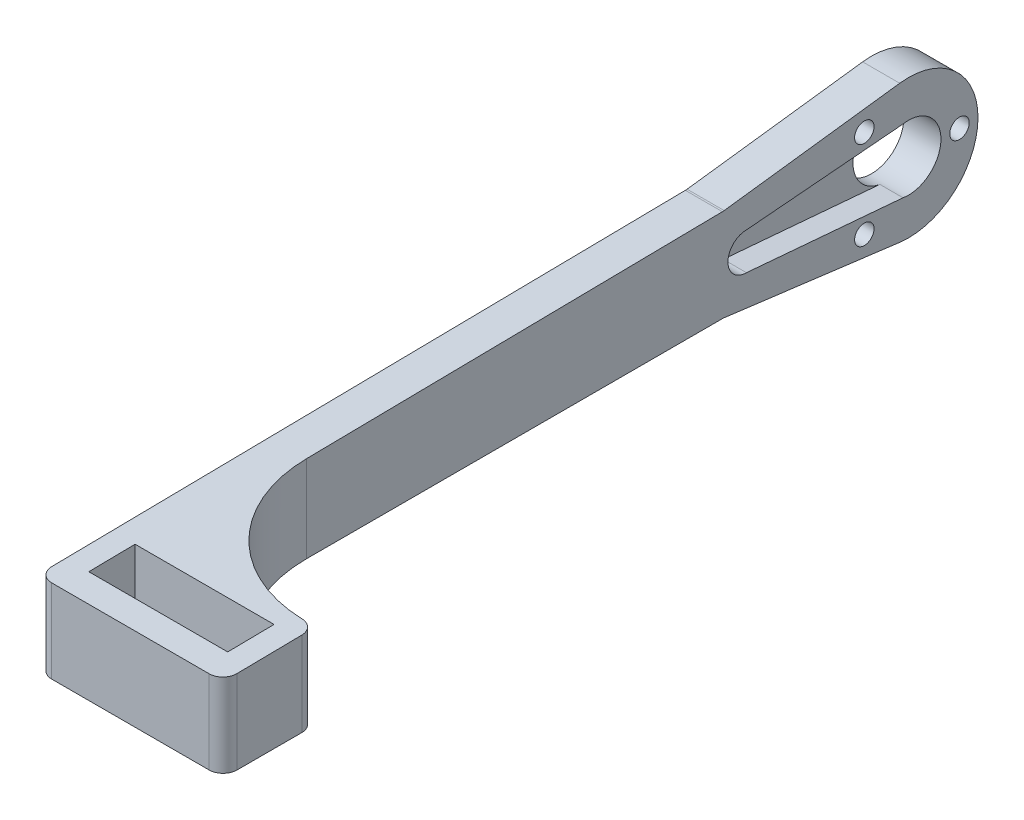
ISO-10303-21;
HEADER;
FILE_DESCRIPTION(('STEP AP214'),'2;1');
FILE_NAME('part.step','',(''),(''),'','','');
FILE_SCHEMA(('AUTOMOTIVE_DESIGN { 1 0 10303 214 1 1 1 1 }'));
ENDSEC;
DATA;
#1=APPLICATION_CONTEXT('core data for automotive mechanical design processes');
#2=APPLICATION_PROTOCOL_DEFINITION('international standard','automotive_design',2000,#1);
#3=PRODUCT_CONTEXT('',#1,'mechanical');
#4=PRODUCT('Part','Part','',(#3));
#5=PRODUCT_RELATED_PRODUCT_CATEGORY('part','',(#4));
#6=PRODUCT_DEFINITION_FORMATION('','',#4);
#7=PRODUCT_DEFINITION_CONTEXT('part definition',#1,'design');
#8=PRODUCT_DEFINITION('design','',#6,#7);
#9=PRODUCT_DEFINITION_SHAPE('','',#8);
#10=(LENGTH_UNIT() NAMED_UNIT(*) SI_UNIT(.MILLI.,.METRE.));
#11=(NAMED_UNIT(*) PLANE_ANGLE_UNIT() SI_UNIT($,.RADIAN.));
#12=(NAMED_UNIT(*) SI_UNIT($,.STERADIAN.) SOLID_ANGLE_UNIT());
#13=UNCERTAINTY_MEASURE_WITH_UNIT(LENGTH_MEASURE(1.E-05),#10,'distance_accuracy_value','');
#14=(GEOMETRIC_REPRESENTATION_CONTEXT(3) GLOBAL_UNCERTAINTY_ASSIGNED_CONTEXT((#13)) GLOBAL_UNIT_ASSIGNED_CONTEXT((#10,
#11,#12)) REPRESENTATION_CONTEXT('',''));
#15=CARTESIAN_POINT('',(0.,0.,0.));
#16=DIRECTION('',(0.,0.,1.));
#17=DIRECTION('',(1.,0.,0.));
#18=AXIS2_PLACEMENT_3D('',#15,#16,#17);
#19=CARTESIAN_POINT('',(4.,0.,0.));
#20=DIRECTION('',(1.,0.,0.));
#21=DIRECTION('',(0.,0.,-1.));
#22=AXIS2_PLACEMENT_3D('',#19,#20,#21);
#23=PLANE('',#22);
#24=DIRECTION('',(0.,0.0143037991941371,-0.999897695431195));
#25=VECTOR('',#24,1.);
#26=CARTESIAN_POINT('',(4.,4.57127503931959,0.0653932902559612));
#27=LINE('',#26,#25);
#28=CARTESIAN_POINT('',(4.,4.35752316910403,15.0075774975294));
#29=VERTEX_POINT('',#28);
#30=CARTESIAN_POINT('',(4.,5.,-29.9043437243606));
#31=VERTEX_POINT('',#30);
#32=EDGE_CURVE('E263',#29,#31,#27,.T.);
#33=ORIENTED_EDGE('',*,*,#32,.F.);
#34=DIRECTION('',(0.,-1.,0.));
#35=VECTOR('',#34,1.);
#36=CARTESIAN_POINT('',(4.,-5.,15.0075774975294));
#37=LINE('',#36,#35);
#38=CARTESIAN_POINT('',(4.,-5.,15.0075774975294));
#39=VERTEX_POINT('',#38);
#40=EDGE_CURVE('E296',#29,#39,#37,.T.);
#41=ORIENTED_EDGE('',*,*,#40,.T.);
#42=DIRECTION('',(0.,0.,-1.));
#43=VECTOR('',#42,1.);
#44=CARTESIAN_POINT('',(4.,-5.,0.));
#45=LINE('',#44,#43);
#46=CARTESIAN_POINT('',(4.,-5.,-29.9043437243606));
#47=VERTEX_POINT('',#46);
#48=EDGE_CURVE('E310',#39,#47,#45,.T.);
#49=ORIENTED_EDGE('',*,*,#48,.T.);
#50=CARTESIAN_POINT('',(4.,-6.5,-29.9043437243606));
#51=DIRECTION('',(1.,0.,0.));
#52=DIRECTION('',(0.,0.,-1.));
#53=AXIS2_PLACEMENT_3D('',#50,#51,#52);
#54=CIRCLE('',#53,1.5);
#55=CARTESIAN_POINT('',(4.,-5.01215075037613,-30.0948814119546));
#56=VERTEX_POINT('',#55);
#57=EDGE_CURVE('E294',#47,#56,#54,.F.);
#58=ORIENTED_EDGE('',*,*,#57,.T.);
#59=DIRECTION('',(0.,-0.127025125062688,-0.991899499749248));
#60=VECTOR('',#59,1.);
#61=CARTESIAN_POINT('',(4.,-1.13943834785606,0.145919318110584));
#62=LINE('',#61,#60);
#63=CARTESIAN_POINT('',(4.,-7.43924624811936,-49.0473115620298));
#64=VERTEX_POINT('',#63);
#65=EDGE_CURVE('E430',#56,#64,#62,.T.);
#66=ORIENTED_EDGE('',*,*,#65,.T.);
#67=CARTESIAN_POINT('',(4.,0.,-50.));
#68=DIRECTION('',(1.,0.,0.));
#69=DIRECTION('',(0.,0.,-1.));
#70=AXIS2_PLACEMENT_3D('',#67,#68,#69);
#71=CIRCLE('',#70,7.5);
#72=CARTESIAN_POINT('',(4.,7.43924624811936,-49.0473115620298));
#73=VERTEX_POINT('',#72);
#74=EDGE_CURVE('E423',#73,#64,#71,.F.);
#75=ORIENTED_EDGE('',*,*,#74,.F.);
#76=DIRECTION('',(0.,0.127025125062688,-0.991899499749248));
#77=VECTOR('',#76,1.);
#78=CARTESIAN_POINT('',(4.,1.13943834785606,0.145919318110584));
#79=LINE('',#78,#77);
#80=CARTESIAN_POINT('',(4.,5.01215075037613,-30.0948814119546));
#81=VERTEX_POINT('',#80);
#82=EDGE_CURVE('E426',#81,#73,#79,.T.);
#83=ORIENTED_EDGE('',*,*,#82,.F.);
#84=CARTESIAN_POINT('',(4.,6.5,-29.9043437243606));
#85=DIRECTION('',(1.,0.,0.));
#86=DIRECTION('',(0.,0.,-1.));
#87=AXIS2_PLACEMENT_3D('',#84,#85,#86);
#88=CIRCLE('',#87,1.5);
#89=EDGE_CURVE('E284',#81,#31,#88,.F.);
#90=ORIENTED_EDGE('',*,*,#89,.T.);
#91=EDGE_LOOP('',(#33,#41,#49,#58,#66,#75,#83,#90));
#92=FACE_BOUND('',#91,.T.);
#93=CARTESIAN_POINT('',(4.,-4.77297077300917,-45.2270292269908));
#94=DIRECTION('',(-1.,0.,0.));
#95=DIRECTION('',(0.,0.,1.));
#96=AXIS2_PLACEMENT_3D('',#93,#94,#95);
#97=CIRCLE('',#96,1.05);
#98=CARTESIAN_POINT('',(4.,-4.77297077300917,-44.1770292269908));
#99=VERTEX_POINT('',#98);
#100=EDGE_CURVE('E384',#99,#99,#97,.T.);
#101=ORIENTED_EDGE('',*,*,#100,.T.);
#102=EDGE_LOOP('',(#101));
#103=FACE_BOUND('',#102,.T.);
#104=CARTESIAN_POINT('',(4.,0.,-32.5));
#105=DIRECTION('',(1.,0.,0.));
#106=DIRECTION('',(0.,0.,-1.));
#107=AXIS2_PLACEMENT_3D('',#104,#105,#106);
#108=CIRCLE('',#107,2.);
#109=CARTESIAN_POINT('',(4.,-2.,-32.5));
#110=VERTEX_POINT('',#109);
#111=CARTESIAN_POINT('',(4.,2.,-32.5));
#112=VERTEX_POINT('',#111);
#113=EDGE_CURVE('E374',#110,#112,#108,.F.);
#114=ORIENTED_EDGE('',*,*,#113,.T.);
#115=DIRECTION('',(0.,0.0854011413464358,-0.996346649041751));
#116=VECTOR('',#115,1.);
#117=CARTESIAN_POINT('',(4.,-0.779983792544568,-0.0668557536466772));
#118=LINE('',#117,#116);
#119=CARTESIAN_POINT('',(4.,3.44894651539708,-49.404376012966));
#120=VERTEX_POINT('',#119);
#121=EDGE_CURVE('E393',#112,#120,#118,.T.);
#122=ORIENTED_EDGE('',*,*,#121,.T.);
#123=CARTESIAN_POINT('',(4.,0.,-50.));
#124=DIRECTION('',(1.,0.,0.));
#125=DIRECTION('',(0.,0.,-1.));
#126=AXIS2_PLACEMENT_3D('',#123,#124,#125);
#127=CIRCLE('',#126,3.5);
#128=CARTESIAN_POINT('',(4.,-3.44894651539708,-49.404376012966));
#129=VERTEX_POINT('',#128);
#130=EDGE_CURVE('E410',#129,#120,#127,.T.);
#131=ORIENTED_EDGE('',*,*,#130,.F.);
#132=DIRECTION('',(0.,-0.0854011413464358,-0.996346649041751));
#133=VECTOR('',#132,1.);
#134=CARTESIAN_POINT('',(4.,0.779983792544568,-0.0668557536466772));
#135=LINE('',#134,#133);
#136=EDGE_CURVE('E403',#110,#129,#135,.T.);
#137=ORIENTED_EDGE('',*,*,#136,.F.);
#138=EDGE_LOOP('',(#114,#122,#131,#137));
#139=FACE_BOUND('',#138,.T.);
#140=CARTESIAN_POINT('',(4.,4.77297077300917,-45.2270292269908));
#141=DIRECTION('',(1.,0.,0.));
#142=DIRECTION('',(0.,0.,-1.));
#143=AXIS2_PLACEMENT_3D('',#140,#141,#142);
#144=CIRCLE('',#143,1.05);
#145=CARTESIAN_POINT('',(4.,4.77297077300917,-46.2770292269908));
#146=VERTEX_POINT('',#145);
#147=EDGE_CURVE('E378',#146,#146,#144,.T.);
#148=ORIENTED_EDGE('',*,*,#147,.F.);
#149=EDGE_LOOP('',(#148));
#150=FACE_BOUND('',#149,.T.);
#151=CARTESIAN_POINT('',(4.,0.,-55.5));
#152=DIRECTION('',(1.,0.,0.));
#153=DIRECTION('',(0.,0.,-1.));
#154=AXIS2_PLACEMENT_3D('',#151,#152,#153);
#155=CIRCLE('',#154,1.05);
#156=CARTESIAN_POINT('',(4.,0.,-56.55));
#157=VERTEX_POINT('',#156);
#158=EDGE_CURVE('E375',#157,#157,#155,.T.);
#159=ORIENTED_EDGE('',*,*,#158,.F.);
#160=EDGE_LOOP('',(#159));
#161=FACE_BOUND('',#160,.T.);
#162=ADVANCED_FACE('F117',(#92,#103,#139,#150,#161),#23,.T.);
#163=CARTESIAN_POINT('',(0.,0.,0.));
#164=DIRECTION('',(1.,0.,0.));
#165=DIRECTION('',(0.,0.,-1.));
#166=AXIS2_PLACEMENT_3D('',#163,#164,#165);
#167=PLANE('',#166);
#168=CARTESIAN_POINT('',(0.,4.77297077300917,-45.2270292269908));
#169=DIRECTION('',(1.,0.,0.));
#170=DIRECTION('',(0.,0.,-1.));
#171=AXIS2_PLACEMENT_3D('',#168,#169,#170);
#172=CIRCLE('',#171,1.05);
#173=CARTESIAN_POINT('',(0.,4.77297077300917,-46.2770292269908));
#174=VERTEX_POINT('',#173);
#175=EDGE_CURVE('E381',#174,#174,#172,.T.);
#176=ORIENTED_EDGE('',*,*,#175,.T.);
#177=EDGE_LOOP('',(#176));
#178=FACE_BOUND('',#177,.T.);
#179=CARTESIAN_POINT('',(0.,-4.77297077300917,-45.2270292269908));
#180=DIRECTION('',(-1.,0.,0.));
#181=DIRECTION('',(0.,0.,1.));
#182=AXIS2_PLACEMENT_3D('',#179,#180,#181);
#183=CIRCLE('',#182,1.05);
#184=CARTESIAN_POINT('',(0.,-4.77297077300917,-44.1770292269908));
#185=VERTEX_POINT('',#184);
#186=EDGE_CURVE('E370',#185,#185,#183,.T.);
#187=ORIENTED_EDGE('',*,*,#186,.F.);
#188=EDGE_LOOP('',(#187));
#189=FACE_BOUND('',#188,.T.);
#190=CARTESIAN_POINT('',(0.,0.,-50.));
#191=DIRECTION('',(1.,0.,0.));
#192=DIRECTION('',(0.,0.,-1.));
#193=AXIS2_PLACEMENT_3D('',#190,#191,#192);
#194=CIRCLE('',#193,3.5);
#195=CARTESIAN_POINT('',(0.,0.,-53.5));
#196=VERTEX_POINT('',#195);
#197=EDGE_CURVE('E419',#196,#196,#194,.T.);
#198=ORIENTED_EDGE('',*,*,#197,.T.);
#199=EDGE_LOOP('',(#198));
#200=FACE_BOUND('',#199,.T.);
#201=DIRECTION('',(0.,-1.,0.));
#202=VECTOR('',#201,1.);
#203=CARTESIAN_POINT('',(0.,5.,38.5));
#204=LINE('',#203,#202);
#205=CARTESIAN_POINT('',(0.,-5.,38.5));
#206=VERTEX_POINT('',#205);
#207=CARTESIAN_POINT('',(0.,4.0214578940318,38.5));
#208=VERTEX_POINT('',#207);
#209=EDGE_CURVE('E269',#206,#208,#204,.F.);
#210=ORIENTED_EDGE('',*,*,#209,.T.);
#211=DIRECTION('',(0.,0.0143037991941371,-0.999897695431195));
#212=VECTOR('',#211,1.);
#213=CARTESIAN_POINT('',(0.,4.57127503931959,0.0653932902559612));
#214=LINE('',#213,#212);
#215=CARTESIAN_POINT('',(0.,5.,-29.9043437243606));
#216=VERTEX_POINT('',#215);
#217=EDGE_CURVE('E260',#208,#216,#214,.T.);
#218=ORIENTED_EDGE('',*,*,#217,.T.);
#219=CARTESIAN_POINT('',(0.,6.5,-29.9043437243606));
#220=DIRECTION('',(1.,0.,0.));
#221=DIRECTION('',(0.,0.,-1.));
#222=AXIS2_PLACEMENT_3D('',#219,#220,#221);
#223=CIRCLE('',#222,1.5);
#224=CARTESIAN_POINT('',(0.,5.01215075037613,-30.0948814119546));
#225=VERTEX_POINT('',#224);
#226=EDGE_CURVE('E275',#216,#225,#223,.T.);
#227=ORIENTED_EDGE('',*,*,#226,.T.);
#228=DIRECTION('',(0.,0.127025125062688,-0.991899499749248));
#229=VECTOR('',#228,1.);
#230=CARTESIAN_POINT('',(0.,1.13943834785606,0.145919318110584));
#231=LINE('',#230,#229);
#232=CARTESIAN_POINT('',(0.,7.43924624811936,-49.0473115620298));
#233=VERTEX_POINT('',#232);
#234=EDGE_CURVE('E435',#225,#233,#231,.T.);
#235=ORIENTED_EDGE('',*,*,#234,.T.);
#236=CARTESIAN_POINT('',(0.,0.,-50.));
#237=DIRECTION('',(1.,0.,0.));
#238=DIRECTION('',(0.,0.,-1.));
#239=AXIS2_PLACEMENT_3D('',#236,#237,#238);
#240=CIRCLE('',#239,7.5);
#241=CARTESIAN_POINT('',(0.,-7.43924624811936,-49.0473115620298));
#242=VERTEX_POINT('',#241);
#243=EDGE_CURVE('E422',#233,#242,#240,.F.);
#244=ORIENTED_EDGE('',*,*,#243,.T.);
#245=DIRECTION('',(0.,-0.127025125062688,-0.991899499749248));
#246=VECTOR('',#245,1.);
#247=CARTESIAN_POINT('',(0.,-1.13943834785606,0.145919318110584));
#248=LINE('',#247,#246);
#249=CARTESIAN_POINT('',(0.,-5.01215075037613,-30.0948814119546));
#250=VERTEX_POINT('',#249);
#251=EDGE_CURVE('E427',#250,#242,#248,.T.);
#252=ORIENTED_EDGE('',*,*,#251,.F.);
#253=CARTESIAN_POINT('',(0.,-6.5,-29.9043437243606));
#254=DIRECTION('',(1.,0.,0.));
#255=DIRECTION('',(0.,0.,-1.));
#256=AXIS2_PLACEMENT_3D('',#253,#254,#255);
#257=CIRCLE('',#256,1.5);
#258=CARTESIAN_POINT('',(0.,-5.,-29.9043437243606));
#259=VERTEX_POINT('',#258);
#260=EDGE_CURVE('E287',#250,#259,#257,.T.);
#261=ORIENTED_EDGE('',*,*,#260,.T.);
#262=DIRECTION('',(0.,0.,-1.));
#263=VECTOR('',#262,1.);
#264=CARTESIAN_POINT('',(0.,-5.,0.));
#265=LINE('',#264,#263);
#266=EDGE_CURVE('E437',#206,#259,#265,.T.);
#267=ORIENTED_EDGE('',*,*,#266,.F.);
#268=EDGE_LOOP('',(#210,#218,#227,#235,#244,#252,#261,#267));
#269=FACE_BOUND('',#268,.T.);
#270=CARTESIAN_POINT('',(0.,0.,-55.5));
#271=DIRECTION('',(1.,0.,0.));
#272=DIRECTION('',(0.,0.,-1.));
#273=AXIS2_PLACEMENT_3D('',#270,#271,#272);
#274=CIRCLE('',#273,1.05);
#275=CARTESIAN_POINT('',(0.,0.,-56.55));
#276=VERTEX_POINT('',#275);
#277=EDGE_CURVE('E371',#276,#276,#274,.T.);
#278=ORIENTED_EDGE('',*,*,#277,.T.);
#279=EDGE_LOOP('',(#278));
#280=FACE_BOUND('',#279,.T.);
#281=ADVANCED_FACE('F273',(#178,#189,#200,#269,#280),#167,.F.);
#282=CARTESIAN_POINT('',(-6.,0.,-50.));
#283=DIRECTION('',(1.,0.,0.));
#284=DIRECTION('',(0.,0.,-1.));
#285=AXIS2_PLACEMENT_3D('',#282,#283,#284);
#286=CYLINDRICAL_SURFACE('',#285,3.5);
#287=ORIENTED_EDGE('',*,*,#197,.F.);
#288=EDGE_LOOP('',(#287));
#289=FACE_BOUND('',#288,.T.);
#290=DIRECTION('',(1.,0.,0.));
#291=VECTOR('',#290,1.);
#292=CARTESIAN_POINT('',(1.5,3.44894651539708,-49.404376012966));
#293=LINE('',#292,#291);
#294=CARTESIAN_POINT('',(1.5,3.44894651539708,-49.404376012966));
#295=VERTEX_POINT('',#294);
#296=EDGE_CURVE('E411',#295,#120,#293,.T.);
#297=ORIENTED_EDGE('',*,*,#296,.F.);
#298=CARTESIAN_POINT('',(1.5,0.,-50.));
#299=DIRECTION('',(1.,0.,0.));
#300=DIRECTION('',(0.,0.,-1.));
#301=AXIS2_PLACEMENT_3D('',#298,#299,#300);
#302=CIRCLE('',#301,3.5);
#303=CARTESIAN_POINT('',(1.5,-3.44894651539708,-49.404376012966));
#304=VERTEX_POINT('',#303);
#305=EDGE_CURVE('E395',#304,#295,#302,.F.);
#306=ORIENTED_EDGE('',*,*,#305,.F.);
#307=DIRECTION('',(1.,0.,0.));
#308=VECTOR('',#307,1.);
#309=CARTESIAN_POINT('',(1.5,-3.44894651539708,-49.404376012966));
#310=LINE('',#309,#308);
#311=EDGE_CURVE('E413',#304,#129,#310,.T.);
#312=ORIENTED_EDGE('',*,*,#311,.T.);
#313=ORIENTED_EDGE('',*,*,#130,.T.);
#314=EDGE_LOOP('',(#297,#306,#312,#313));
#315=FACE_BOUND('',#314,.T.);
#316=ADVANCED_FACE('F509',(#289,#315),#286,.F.);
#317=CARTESIAN_POINT('',(4.,1.13943834785606,0.145919318110584));
#318=DIRECTION('',(0.,0.991899499749248,0.127025125062688));
#319=DIRECTION('',(0.,-0.127025125062688,0.991899499749248));
#320=AXIS2_PLACEMENT_3D('',#317,#318,#319);
#321=PLANE('',#320);
#322=ORIENTED_EDGE('',*,*,#234,.F.);
#323=DIRECTION('',(-1.,0.,0.));
#324=VECTOR('',#323,1.);
#325=CARTESIAN_POINT('',(4.,5.01215075037613,-30.0948814119546));
#326=LINE('',#325,#324);
#327=EDGE_CURVE('E283',#225,#81,#326,.F.);
#328=ORIENTED_EDGE('',*,*,#327,.T.);
#329=ORIENTED_EDGE('',*,*,#82,.T.);
#330=DIRECTION('',(-1.,0.,0.));
#331=VECTOR('',#330,1.);
#332=CARTESIAN_POINT('',(4.,7.43924624811936,-49.0473115620298));
#333=LINE('',#332,#331);
#334=EDGE_CURVE('E443',#73,#233,#333,.T.);
#335=ORIENTED_EDGE('',*,*,#334,.T.);
#336=EDGE_LOOP('',(#322,#328,#329,#335));
#337=FACE_BOUND('',#336,.T.);
#338=ADVANCED_FACE('F458',(#337),#321,.T.);
#339=CARTESIAN_POINT('',(4.,0.,-50.));
#340=DIRECTION('',(-1.,0.,0.));
#341=DIRECTION('',(0.,0.,1.));
#342=AXIS2_PLACEMENT_3D('',#339,#340,#341);
#343=CYLINDRICAL_SURFACE('',#342,7.5);
#344=ORIENTED_EDGE('',*,*,#243,.F.);
#345=ORIENTED_EDGE('',*,*,#334,.F.);
#346=ORIENTED_EDGE('',*,*,#74,.T.);
#347=DIRECTION('',(-1.,0.,0.));
#348=VECTOR('',#347,1.);
#349=CARTESIAN_POINT('',(4.,-7.43924624811936,-49.0473115620298));
#350=LINE('',#349,#348);
#351=EDGE_CURVE('E432',#64,#242,#350,.T.);
#352=ORIENTED_EDGE('',*,*,#351,.T.);
#353=EDGE_LOOP('',(#344,#345,#346,#352));
#354=FACE_BOUND('',#353,.T.);
#355=ADVANCED_FACE('F465',(#354),#343,.T.);
#356=CARTESIAN_POINT('',(4.,-1.13943834785606,0.145919318110584));
#357=DIRECTION('',(0.,0.991899499749248,-0.127025125062688));
#358=DIRECTION('',(0.,0.127025125062688,0.991899499749248));
#359=AXIS2_PLACEMENT_3D('',#356,#357,#358);
#360=PLANE('',#359);
#361=ORIENTED_EDGE('',*,*,#65,.F.);
#362=DIRECTION('',(-1.,0.,0.));
#363=VECTOR('',#362,1.);
#364=CARTESIAN_POINT('',(0.,-5.01215075037613,-30.0948814119546));
#365=LINE('',#364,#363);
#366=EDGE_CURVE('E285',#56,#250,#365,.T.);
#367=ORIENTED_EDGE('',*,*,#366,.T.);
#368=ORIENTED_EDGE('',*,*,#251,.T.);
#369=ORIENTED_EDGE('',*,*,#351,.F.);
#370=EDGE_LOOP('',(#361,#367,#368,#369));
#371=FACE_BOUND('',#370,.T.);
#372=ADVANCED_FACE('F468',(#371),#360,.F.);
#373=CARTESIAN_POINT('',(4.,-5.,0.));
#374=DIRECTION('',(0.,1.,0.));
#375=DIRECTION('',(0.,0.,1.));
#376=AXIS2_PLACEMENT_3D('',#373,#374,#375);
#377=PLANE('',#376);
#378=DIRECTION('',(0.,0.,-1.));
#379=VECTOR('',#378,1.);
#380=CARTESIAN_POINT('',(17.5,-5.,37.));
#381=LINE('',#380,#379);
#382=CARTESIAN_POINT('',(17.5,-5.,37.));
#383=VERTEX_POINT('',#382);
#384=CARTESIAN_POINT('',(17.5,-5.,32.));
#385=VERTEX_POINT('',#384);
#386=EDGE_CURVE('E351',#383,#385,#381,.T.);
#387=ORIENTED_EDGE('',*,*,#386,.T.);
#388=DIRECTION('',(-1.,0.,0.));
#389=VECTOR('',#388,1.);
#390=CARTESIAN_POINT('',(17.5,-5.,32.));
#391=LINE('',#390,#389);
#392=CARTESIAN_POINT('',(2.5,-5.,32.));
#393=VERTEX_POINT('',#392);
#394=EDGE_CURVE('E343',#385,#393,#391,.T.);
#395=ORIENTED_EDGE('',*,*,#394,.T.);
#396=DIRECTION('',(0.,0.,-1.));
#397=VECTOR('',#396,1.);
#398=CARTESIAN_POINT('',(2.5,-5.,37.));
#399=LINE('',#398,#397);
#400=CARTESIAN_POINT('',(2.5,-5.,37.));
#401=VERTEX_POINT('',#400);
#402=EDGE_CURVE('E346',#401,#393,#399,.T.);
#403=ORIENTED_EDGE('',*,*,#402,.F.);
#404=DIRECTION('',(-1.,0.,0.));
#405=VECTOR('',#404,1.);
#406=CARTESIAN_POINT('',(17.5,-5.,37.));
#407=LINE('',#406,#405);
#408=EDGE_CURVE('E348',#383,#401,#407,.T.);
#409=ORIENTED_EDGE('',*,*,#408,.F.);
#410=EDGE_LOOP('',(#387,#395,#403,#409));
#411=FACE_BOUND('',#410,.T.);
#412=DIRECTION('',(-1.,0.,0.));
#413=VECTOR('',#412,1.);
#414=CARTESIAN_POINT('',(0.,-5.,40.));
#415=LINE('',#414,#413);
#416=CARTESIAN_POINT('',(18.5,-5.,40.));
#417=VERTEX_POINT('',#416);
#418=CARTESIAN_POINT('',(1.5,-5.,40.));
#419=VERTEX_POINT('',#418);
#420=EDGE_CURVE('E358',#417,#419,#415,.T.);
#421=ORIENTED_EDGE('',*,*,#420,.T.);
#422=CARTESIAN_POINT('',(1.5,-5.,38.5));
#423=DIRECTION('',(0.,1.,0.));
#424=DIRECTION('',(0.,0.,1.));
#425=AXIS2_PLACEMENT_3D('',#422,#423,#424);
#426=CIRCLE('',#425,1.5);
#427=EDGE_CURVE('E319',#419,#206,#426,.F.);
#428=ORIENTED_EDGE('',*,*,#427,.T.);
#429=ORIENTED_EDGE('',*,*,#266,.T.);
#430=DIRECTION('',(-1.,0.,0.));
#431=VECTOR('',#430,1.);
#432=CARTESIAN_POINT('',(4.,-5.,-29.9043437243606));
#433=LINE('',#432,#431);
#434=EDGE_CURVE('E451',#259,#47,#433,.F.);
#435=ORIENTED_EDGE('',*,*,#434,.T.);
#436=ORIENTED_EDGE('',*,*,#48,.F.);
#437=CARTESIAN_POINT('',(19.,-5.,15.0075774975294));
#438=DIRECTION('',(0.,1.,0.));
#439=DIRECTION('',(0.,0.,1.));
#440=AXIS2_PLACEMENT_3D('',#437,#438,#439);
#441=CIRCLE('',#440,15.);
#442=CARTESIAN_POINT('',(18.5454545454545,-5.,30.0006888634118));
#443=VERTEX_POINT('',#442);
#444=EDGE_CURVE('E125',#39,#443,#441,.T.);
#445=ORIENTED_EDGE('',*,*,#444,.T.);
#446=CARTESIAN_POINT('',(18.5,-5.,31.5));
#447=DIRECTION('',(0.,1.,0.));
#448=DIRECTION('',(0.,0.,1.));
#449=AXIS2_PLACEMENT_3D('',#446,#447,#448);
#450=CIRCLE('',#449,1.5);
#451=CARTESIAN_POINT('',(20.,-5.,31.5));
#452=VERTEX_POINT('',#451);
#453=EDGE_CURVE('E307',#443,#452,#450,.F.);
#454=ORIENTED_EDGE('',*,*,#453,.T.);
#455=DIRECTION('',(0.,0.,-1.));
#456=VECTOR('',#455,1.);
#457=CARTESIAN_POINT('',(20.,-5.,40.));
#458=LINE('',#457,#456);
#459=CARTESIAN_POINT('',(20.,-5.,38.5));
#460=VERTEX_POINT('',#459);
#461=EDGE_CURVE('E368',#460,#452,#458,.T.);
#462=ORIENTED_EDGE('',*,*,#461,.F.);
#463=CARTESIAN_POINT('',(18.5,-5.,38.5));
#464=DIRECTION('',(0.,1.,0.));
#465=DIRECTION('',(0.,0.,1.));
#466=AXIS2_PLACEMENT_3D('',#463,#464,#465);
#467=CIRCLE('',#466,1.5);
#468=EDGE_CURVE('E320',#460,#417,#467,.F.);
#469=ORIENTED_EDGE('',*,*,#468,.T.);
#470=EDGE_LOOP('',(#421,#428,#429,#435,#436,#445,#454,#462,#469));
#471=FACE_BOUND('',#470,.T.);
#472=ADVANCED_FACE('F305',(#411,#471),#377,.F.);
#473=CARTESIAN_POINT('',(1.5,0.,-32.5));
#474=DIRECTION('',(1.,0.,0.));
#475=DIRECTION('',(0.,0.,-1.));
#476=AXIS2_PLACEMENT_3D('',#473,#474,#475);
#477=CYLINDRICAL_SURFACE('',#476,2.);
#478=ORIENTED_EDGE('',*,*,#113,.F.);
#479=DIRECTION('',(1.,0.,0.));
#480=VECTOR('',#479,1.);
#481=CARTESIAN_POINT('',(1.5,-2.,-32.5));
#482=LINE('',#481,#480);
#483=CARTESIAN_POINT('',(1.5,-2.,-32.5));
#484=VERTEX_POINT('',#483);
#485=EDGE_CURVE('E400',#484,#110,#482,.T.);
#486=ORIENTED_EDGE('',*,*,#485,.F.);
#487=CARTESIAN_POINT('',(1.5,0.,-32.5));
#488=DIRECTION('',(1.,0.,0.));
#489=DIRECTION('',(0.,0.,-1.));
#490=AXIS2_PLACEMENT_3D('',#487,#488,#489);
#491=CIRCLE('',#490,2.);
#492=CARTESIAN_POINT('',(1.5,2.,-32.5));
#493=VERTEX_POINT('',#492);
#494=EDGE_CURVE('E389',#484,#493,#491,.F.);
#495=ORIENTED_EDGE('',*,*,#494,.T.);
#496=DIRECTION('',(1.,0.,0.));
#497=VECTOR('',#496,1.);
#498=CARTESIAN_POINT('',(1.5,2.,-32.5));
#499=LINE('',#498,#497);
#500=EDGE_CURVE('E407',#493,#112,#499,.T.);
#501=ORIENTED_EDGE('',*,*,#500,.T.);
#502=EDGE_LOOP('',(#478,#486,#495,#501));
#503=FACE_BOUND('',#502,.T.);
#504=ADVANCED_FACE('F519',(#503),#477,.F.);
#505=CARTESIAN_POINT('',(1.5,-0.779983792544568,-0.0668557536466772));
#506=DIRECTION('',(0.,-0.996346649041751,-0.0854011413464358));
#507=DIRECTION('',(0.,0.0854011413464358,-0.996346649041751));
#508=AXIS2_PLACEMENT_3D('',#505,#506,#507);
#509=PLANE('',#508);
#510=ORIENTED_EDGE('',*,*,#121,.F.);
#511=ORIENTED_EDGE('',*,*,#500,.F.);
#512=DIRECTION('',(0.,0.0854011413464358,-0.996346649041751));
#513=VECTOR('',#512,1.);
#514=CARTESIAN_POINT('',(1.5,-0.779983792544568,-0.0668557536466772));
#515=LINE('',#514,#513);
#516=EDGE_CURVE('E398',#493,#295,#515,.T.);
#517=ORIENTED_EDGE('',*,*,#516,.T.);
#518=ORIENTED_EDGE('',*,*,#296,.T.);
#519=EDGE_LOOP('',(#510,#511,#517,#518));
#520=FACE_BOUND('',#519,.T.);
#521=ADVANCED_FACE('F708',(#520),#509,.T.);
#522=CARTESIAN_POINT('',(1.5,0.779983792544568,-0.0668557536466772));
#523=DIRECTION('',(0.,-0.996346649041751,0.0854011413464358));
#524=DIRECTION('',(0.,-0.0854011413464358,-0.996346649041751));
#525=AXIS2_PLACEMENT_3D('',#522,#523,#524);
#526=PLANE('',#525);
#527=ORIENTED_EDGE('',*,*,#136,.T.);
#528=ORIENTED_EDGE('',*,*,#311,.F.);
#529=DIRECTION('',(0.,-0.0854011413464358,-0.996346649041751));
#530=VECTOR('',#529,1.);
#531=CARTESIAN_POINT('',(1.5,0.779983792544568,-0.0668557536466772));
#532=LINE('',#531,#530);
#533=EDGE_CURVE('E392',#484,#304,#532,.T.);
#534=ORIENTED_EDGE('',*,*,#533,.F.);
#535=ORIENTED_EDGE('',*,*,#485,.T.);
#536=EDGE_LOOP('',(#527,#528,#534,#535));
#537=FACE_BOUND('',#536,.T.);
#538=ADVANCED_FACE('F716',(#537),#526,.F.);
#539=CARTESIAN_POINT('',(1.5,0.,0.));
#540=DIRECTION('',(1.,0.,0.));
#541=DIRECTION('',(0.,0.,-1.));
#542=AXIS2_PLACEMENT_3D('',#539,#540,#541);
#543=PLANE('',#542);
#544=ORIENTED_EDGE('',*,*,#494,.F.);
#545=ORIENTED_EDGE('',*,*,#533,.T.);
#546=ORIENTED_EDGE('',*,*,#305,.T.);
#547=ORIENTED_EDGE('',*,*,#516,.F.);
#548=EDGE_LOOP('',(#544,#545,#546,#547));
#549=FACE_BOUND('',#548,.T.);
#550=ADVANCED_FACE('F725',(#549),#543,.T.);
#551=CARTESIAN_POINT('',(0.,-4.77297077300917,-45.2270292269908));
#552=DIRECTION('',(1.,0.,0.));
#553=DIRECTION('',(0.,0.,-1.));
#554=AXIS2_PLACEMENT_3D('',#551,#552,#553);
#555=CYLINDRICAL_SURFACE('',#554,1.05);
#556=ORIENTED_EDGE('',*,*,#186,.T.);
#557=EDGE_LOOP('',(#556));
#558=FACE_BOUND('',#557,.T.);
#559=ORIENTED_EDGE('',*,*,#100,.F.);
#560=EDGE_LOOP('',(#559));
#561=FACE_BOUND('',#560,.T.);
#562=ADVANCED_FACE('F733',(#558,#561),#555,.F.);
#563=CARTESIAN_POINT('',(0.,4.77297077300917,-45.2270292269908));
#564=DIRECTION('',(1.,0.,0.));
#565=DIRECTION('',(0.,0.,-1.));
#566=AXIS2_PLACEMENT_3D('',#563,#564,#565);
#567=CYLINDRICAL_SURFACE('',#566,1.05);
#568=ORIENTED_EDGE('',*,*,#175,.F.);
#569=EDGE_LOOP('',(#568));
#570=FACE_BOUND('',#569,.T.);
#571=ORIENTED_EDGE('',*,*,#147,.T.);
#572=EDGE_LOOP('',(#571));
#573=FACE_BOUND('',#572,.T.);
#574=ADVANCED_FACE('F501',(#570,#573),#567,.F.);
#575=CARTESIAN_POINT('',(0.,0.,-55.5));
#576=DIRECTION('',(1.,0.,0.));
#577=DIRECTION('',(0.,0.,-1.));
#578=AXIS2_PLACEMENT_3D('',#575,#576,#577);
#579=CYLINDRICAL_SURFACE('',#578,1.05);
#580=ORIENTED_EDGE('',*,*,#277,.F.);
#581=EDGE_LOOP('',(#580));
#582=FACE_BOUND('',#581,.T.);
#583=ORIENTED_EDGE('',*,*,#158,.T.);
#584=EDGE_LOOP('',(#583));
#585=FACE_BOUND('',#584,.T.);
#586=ADVANCED_FACE('F493',(#582,#585),#579,.F.);
#587=CARTESIAN_POINT('',(20.,0.,40.));
#588=DIRECTION('',(1.,0.,0.));
#589=DIRECTION('',(0.,0.,-1.));
#590=AXIS2_PLACEMENT_3D('',#587,#588,#589);
#591=PLANE('',#590);
#592=DIRECTION('',(0.,0.0143037991941371,-0.999897695431195));
#593=VECTOR('',#592,1.);
#594=CARTESIAN_POINT('',(20.,3.99918160531446,40.0572093434005));
#595=LINE('',#594,#593);
#596=CARTESIAN_POINT('',(20.,4.0214578940318,38.5));
#597=VERTEX_POINT('',#596);
#598=CARTESIAN_POINT('',(20.,4.12159473284688,31.5));
#599=VERTEX_POINT('',#598);
#600=EDGE_CURVE('E326',#597,#599,#595,.T.);
#601=ORIENTED_EDGE('',*,*,#600,.F.);
#602=DIRECTION('',(0.,-1.,0.));
#603=VECTOR('',#602,1.);
#604=CARTESIAN_POINT('',(20.,0.,38.5));
#605=LINE('',#604,#603);
#606=EDGE_CURVE('E268',#597,#460,#605,.T.);
#607=ORIENTED_EDGE('',*,*,#606,.T.);
#608=ORIENTED_EDGE('',*,*,#461,.T.);
#609=DIRECTION('',(0.,-1.,0.));
#610=VECTOR('',#609,1.);
#611=CARTESIAN_POINT('',(20.,5.00000000000001,31.5));
#612=LINE('',#611,#610);
#613=EDGE_CURVE('E318',#452,#599,#612,.F.);
#614=ORIENTED_EDGE('',*,*,#613,.T.);
#615=EDGE_LOOP('',(#601,#607,#608,#614));
#616=FACE_BOUND('',#615,.T.);
#617=ADVANCED_FACE('F491',(#616),#591,.T.);
#618=CARTESIAN_POINT('',(0.,0.,40.));
#619=DIRECTION('',(0.,0.,1.));
#620=DIRECTION('',(1.,0.,0.));
#621=AXIS2_PLACEMENT_3D('',#618,#619,#620);
#622=PLANE('',#621);
#623=DIRECTION('',(1.,0.,0.));
#624=VECTOR('',#623,1.);
#625=CARTESIAN_POINT('',(0.,4.,40.));
#626=LINE('',#625,#624);
#627=CARTESIAN_POINT('',(1.5,4.,40.));
#628=VERTEX_POINT('',#627);
#629=CARTESIAN_POINT('',(18.5,4.,40.));
#630=VERTEX_POINT('',#629);
#631=EDGE_CURVE('E279',#628,#630,#626,.T.);
#632=ORIENTED_EDGE('',*,*,#631,.F.);
#633=DIRECTION('',(0.,-1.,0.));
#634=VECTOR('',#633,1.);
#635=CARTESIAN_POINT('',(1.5,-5.,40.));
#636=LINE('',#635,#634);
#637=EDGE_CURVE('E449',#628,#419,#636,.T.);
#638=ORIENTED_EDGE('',*,*,#637,.T.);
#639=ORIENTED_EDGE('',*,*,#420,.F.);
#640=DIRECTION('',(0.,-1.,0.));
#641=VECTOR('',#640,1.);
#642=CARTESIAN_POINT('',(18.5,0.,40.));
#643=LINE('',#642,#641);
#644=EDGE_CURVE('E446',#417,#630,#643,.F.);
#645=ORIENTED_EDGE('',*,*,#644,.T.);
#646=EDGE_LOOP('',(#632,#638,#639,#645));
#647=FACE_BOUND('',#646,.T.);
#648=ADVANCED_FACE('F481',(#647),#622,.T.);
#649=CARTESIAN_POINT('',(17.5,-5.,32.));
#650=DIRECTION('',(0.,0.,-1.));
#651=DIRECTION('',(-1.,0.,0.));
#652=AXIS2_PLACEMENT_3D('',#649,#650,#651);
#653=PLANE('',#652);
#654=DIRECTION('',(0.,1.,0.));
#655=VECTOR('',#654,1.);
#656=CARTESIAN_POINT('',(17.5,-5.,32.));
#657=LINE('',#656,#655);
#658=CARTESIAN_POINT('',(17.5,4.11444210150295,32.));
#659=VERTEX_POINT('',#658);
#660=EDGE_CURVE('E355',#385,#659,#657,.T.);
#661=ORIENTED_EDGE('',*,*,#660,.T.);
#662=DIRECTION('',(-1.,0.,0.));
#663=VECTOR('',#662,1.);
#664=CARTESIAN_POINT('',(17.5,4.11444210150295,32.));
#665=LINE('',#664,#663);
#666=CARTESIAN_POINT('',(2.5,4.11444210150295,32.));
#667=VERTEX_POINT('',#666);
#668=EDGE_CURVE('E340',#659,#667,#665,.T.);
#669=ORIENTED_EDGE('',*,*,#668,.T.);
#670=DIRECTION('',(0.,1.,0.));
#671=VECTOR('',#670,1.);
#672=CARTESIAN_POINT('',(2.5,-5.,32.));
#673=LINE('',#672,#671);
#674=EDGE_CURVE('E354',#393,#667,#673,.T.);
#675=ORIENTED_EDGE('',*,*,#674,.F.);
#676=ORIENTED_EDGE('',*,*,#394,.F.);
#677=EDGE_LOOP('',(#661,#669,#675,#676));
#678=FACE_BOUND('',#677,.T.);
#679=ADVANCED_FACE('F499',(#678),#653,.F.);
#680=CARTESIAN_POINT('',(17.5,-5.,37.));
#681=DIRECTION('',(1.,0.,0.));
#682=DIRECTION('',(0.,0.,-1.));
#683=AXIS2_PLACEMENT_3D('',#680,#681,#682);
#684=PLANE('',#683);
#685=DIRECTION('',(0.,1.,0.));
#686=VECTOR('',#685,1.);
#687=CARTESIAN_POINT('',(17.5,-5.,37.));
#688=LINE('',#687,#686);
#689=CARTESIAN_POINT('',(17.5,4.0429157880636,37.));
#690=VERTEX_POINT('',#689);
#691=EDGE_CURVE('E359',#383,#690,#688,.T.);
#692=ORIENTED_EDGE('',*,*,#691,.T.);
#693=DIRECTION('',(0.,0.0143037991941371,-0.999897695431195));
#694=VECTOR('',#693,1.);
#695=CARTESIAN_POINT('',(17.5,4.04106561950791,37.1293348186653));
#696=LINE('',#695,#694);
#697=EDGE_CURVE('E337',#690,#659,#696,.T.);
#698=ORIENTED_EDGE('',*,*,#697,.T.);
#699=ORIENTED_EDGE('',*,*,#660,.F.);
#700=ORIENTED_EDGE('',*,*,#386,.F.);
#701=EDGE_LOOP('',(#692,#698,#699,#700));
#702=FACE_BOUND('',#701,.T.);
#703=ADVANCED_FACE('F544',(#702),#684,.F.);
#704=CARTESIAN_POINT('',(17.5,-5.,37.));
#705=DIRECTION('',(0.,0.,-1.));
#706=DIRECTION('',(-1.,0.,0.));
#707=AXIS2_PLACEMENT_3D('',#704,#705,#706);
#708=PLANE('',#707);
#709=DIRECTION('',(-1.,0.,0.));
#710=VECTOR('',#709,1.);
#711=CARTESIAN_POINT('',(17.5,4.0429157880636,37.));
#712=LINE('',#711,#710);
#713=CARTESIAN_POINT('',(2.5,4.04291578806361,37.));
#714=VERTEX_POINT('',#713);
#715=EDGE_CURVE('E132',#690,#714,#712,.T.);
#716=ORIENTED_EDGE('',*,*,#715,.F.);
#717=ORIENTED_EDGE('',*,*,#691,.F.);
#718=ORIENTED_EDGE('',*,*,#408,.T.);
#719=DIRECTION('',(0.,1.,0.));
#720=VECTOR('',#719,1.);
#721=CARTESIAN_POINT('',(2.5,-5.,37.));
#722=LINE('',#721,#720);
#723=EDGE_CURVE('E362',#401,#714,#722,.T.);
#724=ORIENTED_EDGE('',*,*,#723,.T.);
#725=EDGE_LOOP('',(#716,#717,#718,#724));
#726=FACE_BOUND('',#725,.T.);
#727=ADVANCED_FACE('F547',(#726),#708,.T.);
#728=CARTESIAN_POINT('',(2.5,-5.,37.));
#729=DIRECTION('',(1.,0.,0.));
#730=DIRECTION('',(0.,0.,-1.));
#731=AXIS2_PLACEMENT_3D('',#728,#729,#730);
#732=PLANE('',#731);
#733=DIRECTION('',(0.,0.0143037991941371,-0.999897695431195));
#734=VECTOR('',#733,1.);
#735=CARTESIAN_POINT('',(2.5,4.04106561950791,37.1293348186653));
#736=LINE('',#735,#734);
#737=EDGE_CURVE('E334',#714,#667,#736,.T.);
#738=ORIENTED_EDGE('',*,*,#737,.F.);
#739=ORIENTED_EDGE('',*,*,#723,.F.);
#740=ORIENTED_EDGE('',*,*,#402,.T.);
#741=ORIENTED_EDGE('',*,*,#674,.T.);
#742=EDGE_LOOP('',(#738,#739,#740,#741));
#743=FACE_BOUND('',#742,.T.);
#744=ADVANCED_FACE('F527',(#743),#732,.T.);
#745=CARTESIAN_POINT('',(1.5,0.,38.5));
#746=DIRECTION('',(0.,1.,0.));
#747=DIRECTION('',(0.,0.,1.));
#748=AXIS2_PLACEMENT_3D('',#745,#746,#747);
#749=CYLINDRICAL_SURFACE('',#748,1.5);
#750=CARTESIAN_POINT('',(1.5,4.0214578940318,38.5));
#751=DIRECTION('',(0.,-0.999897695431195,-0.0143037991941371));
#752=DIRECTION('',(0.,0.0143037991941371,-0.999897695431195));
#753=AXIS2_PLACEMENT_3D('',#750,#751,#752);
#754=ELLIPSE('',#753,1.50015347255415,1.5);
#755=EDGE_CURVE('E328',#208,#628,#754,.F.);
#756=ORIENTED_EDGE('',*,*,#755,.F.);
#757=ORIENTED_EDGE('',*,*,#209,.F.);
#758=ORIENTED_EDGE('',*,*,#427,.F.);
#759=ORIENTED_EDGE('',*,*,#637,.F.);
#760=EDGE_LOOP('',(#756,#757,#758,#759));
#761=FACE_BOUND('',#760,.T.);
#762=ADVANCED_FACE('F476',(#761),#749,.T.);
#763=CARTESIAN_POINT('',(18.5,0.,31.5));
#764=DIRECTION('',(0.,1.,0.));
#765=DIRECTION('',(0.,0.,1.));
#766=AXIS2_PLACEMENT_3D('',#763,#764,#765);
#767=CYLINDRICAL_SURFACE('',#766,1.5);
#768=CARTESIAN_POINT('',(18.5,4.12159473284688,31.5));
#769=DIRECTION('',(0.,-0.999897695431195,-0.0143037991941371));
#770=DIRECTION('',(0.,0.0143037991941371,-0.999897695431195));
#771=AXIS2_PLACEMENT_3D('',#768,#769,#770);
#772=ELLIPSE('',#771,1.50015347255415,1.5);
#773=CARTESIAN_POINT('',(18.5454545454545,4.14304277250662,30.0006888634118));
#774=VERTEX_POINT('',#773);
#775=EDGE_CURVE('E140',#599,#774,#772,.F.);
#776=ORIENTED_EDGE('',*,*,#775,.F.);
#777=ORIENTED_EDGE('',*,*,#613,.F.);
#778=ORIENTED_EDGE('',*,*,#453,.F.);
#779=DIRECTION('',(0.,1.,0.));
#780=VECTOR('',#779,1.);
#781=CARTESIAN_POINT('',(18.5454545454545,0.,30.0006888634118));
#782=LINE('',#781,#780);
#783=EDGE_CURVE('E298',#443,#774,#782,.T.);
#784=ORIENTED_EDGE('',*,*,#783,.T.);
#785=EDGE_LOOP('',(#776,#777,#778,#784));
#786=FACE_BOUND('',#785,.T.);
#787=ADVANCED_FACE('F316',(#786),#767,.T.);
#788=CARTESIAN_POINT('',(18.5,0.,38.5));
#789=DIRECTION('',(0.,-1.,0.));
#790=DIRECTION('',(0.,0.,-1.));
#791=AXIS2_PLACEMENT_3D('',#788,#789,#790);
#792=CYLINDRICAL_SURFACE('',#791,1.5);
#793=CARTESIAN_POINT('',(18.5,4.0214578940318,38.5));
#794=DIRECTION('',(0.,-0.999897695431195,-0.0143037991941371));
#795=DIRECTION('',(0.,-0.0143037991941371,0.999897695431195));
#796=AXIS2_PLACEMENT_3D('',#793,#794,#795);
#797=ELLIPSE('',#796,1.50015347255415,1.5);
#798=EDGE_CURVE('E325',#630,#597,#797,.F.);
#799=ORIENTED_EDGE('',*,*,#798,.F.);
#800=ORIENTED_EDGE('',*,*,#644,.F.);
#801=ORIENTED_EDGE('',*,*,#468,.F.);
#802=ORIENTED_EDGE('',*,*,#606,.F.);
#803=EDGE_LOOP('',(#799,#800,#801,#802));
#804=FACE_BOUND('',#803,.T.);
#805=ADVANCED_FACE('F487',(#804),#792,.T.);
#806=CARTESIAN_POINT('',(4.,6.5,-29.9043437243606));
#807=DIRECTION('',(1.,0.,0.));
#808=DIRECTION('',(0.,0.,-1.));
#809=AXIS2_PLACEMENT_3D('',#806,#807,#808);
#810=CYLINDRICAL_SURFACE('',#809,1.5);
#811=ORIENTED_EDGE('',*,*,#89,.F.);
#812=ORIENTED_EDGE('',*,*,#327,.F.);
#813=ORIENTED_EDGE('',*,*,#226,.F.);
#814=DIRECTION('',(-1.,0.,0.));
#815=VECTOR('',#814,1.);
#816=CARTESIAN_POINT('',(0.,5.,-29.9043437243606));
#817=LINE('',#816,#815);
#818=EDGE_CURVE('E257',#31,#216,#817,.T.);
#819=ORIENTED_EDGE('',*,*,#818,.F.);
#820=EDGE_LOOP('',(#811,#812,#813,#819));
#821=FACE_BOUND('',#820,.T.);
#822=ADVANCED_FACE('F282',(#821),#810,.F.);
#823=CARTESIAN_POINT('',(4.,-6.5,-29.9043437243606));
#824=DIRECTION('',(1.,0.,0.));
#825=DIRECTION('',(0.,0.,-1.));
#826=AXIS2_PLACEMENT_3D('',#823,#824,#825);
#827=CYLINDRICAL_SURFACE('',#826,1.5);
#828=ORIENTED_EDGE('',*,*,#57,.F.);
#829=ORIENTED_EDGE('',*,*,#434,.F.);
#830=ORIENTED_EDGE('',*,*,#260,.F.);
#831=ORIENTED_EDGE('',*,*,#366,.F.);
#832=EDGE_LOOP('',(#828,#829,#830,#831));
#833=FACE_BOUND('',#832,.T.);
#834=ADVANCED_FACE('F472',(#833),#827,.F.);
#835=CARTESIAN_POINT('',(19.,0.,15.0075774975294));
#836=DIRECTION('',(0.,1.,0.));
#837=DIRECTION('',(0.,0.,1.));
#838=AXIS2_PLACEMENT_3D('',#835,#836,#837);
#839=CYLINDRICAL_SURFACE('',#838,15.);
#840=ORIENTED_EDGE('',*,*,#40,.F.);
#841=CARTESIAN_POINT('',(19.,4.35752316910403,15.0075774975294));
#842=DIRECTION('',(0.,-0.999897695431195,-0.0143037991941371));
#843=DIRECTION('',(0.,0.0143037991941371,-0.999897695431195));
#844=AXIS2_PLACEMENT_3D('',#841,#842,#843);
#845=ELLIPSE('',#844,15.0015347255415,15.);
#846=EDGE_CURVE('E12',#29,#774,#845,.F.);
#847=ORIENTED_EDGE('',*,*,#846,.T.);
#848=ORIENTED_EDGE('',*,*,#783,.F.);
#849=ORIENTED_EDGE('',*,*,#444,.F.);
#850=EDGE_LOOP('',(#840,#847,#848,#849));
#851=FACE_BOUND('',#850,.T.);
#852=ADVANCED_FACE('F119',(#851),#839,.F.);
#853=CARTESIAN_POINT('',(0.,4.57127503931959,0.0653932902559612));
#854=DIRECTION('',(0.,-0.999897695431195,-0.0143037991941371));
#855=DIRECTION('',(0.,0.0143037991941371,-0.999897695431195));
#856=AXIS2_PLACEMENT_3D('',#853,#854,#855);
#857=PLANE('',#856);
#858=ORIENTED_EDGE('',*,*,#755,.T.);
#859=ORIENTED_EDGE('',*,*,#631,.T.);
#860=ORIENTED_EDGE('',*,*,#798,.T.);
#861=ORIENTED_EDGE('',*,*,#600,.T.);
#862=ORIENTED_EDGE('',*,*,#775,.T.);
#863=ORIENTED_EDGE('',*,*,#846,.F.);
#864=ORIENTED_EDGE('',*,*,#32,.T.);
#865=ORIENTED_EDGE('',*,*,#818,.T.);
#866=ORIENTED_EDGE('',*,*,#217,.F.);
#867=EDGE_LOOP('',(#858,#859,#860,#861,#862,#863,#864,#865,#866));
#868=FACE_BOUND('',#867,.T.);
#869=ORIENTED_EDGE('',*,*,#697,.F.);
#870=ORIENTED_EDGE('',*,*,#715,.T.);
#871=ORIENTED_EDGE('',*,*,#737,.T.);
#872=ORIENTED_EDGE('',*,*,#668,.F.);
#873=EDGE_LOOP('',(#869,#870,#871,#872));
#874=FACE_BOUND('',#873,.T.);
#875=ADVANCED_FACE('F259',(#868,#874),#857,.F.);
#876=CLOSED_SHELL('',(#162,#281,#316,#338,#355,#372,#472,#504,#521,#538,#550,#562,#574,#586,
#617,#648,#679,#703,#727,#744,#762,#787,#805,#822,#834,#852,#875));
#877=MANIFOLD_SOLID_BREP('B2',#876);
#878=ADVANCED_BREP_SHAPE_REPRESENTATION('',(#18,#877),#14);
#879=SHAPE_DEFINITION_REPRESENTATION(#9,#878);
ENDSEC;
END-ISO-10303-21;
